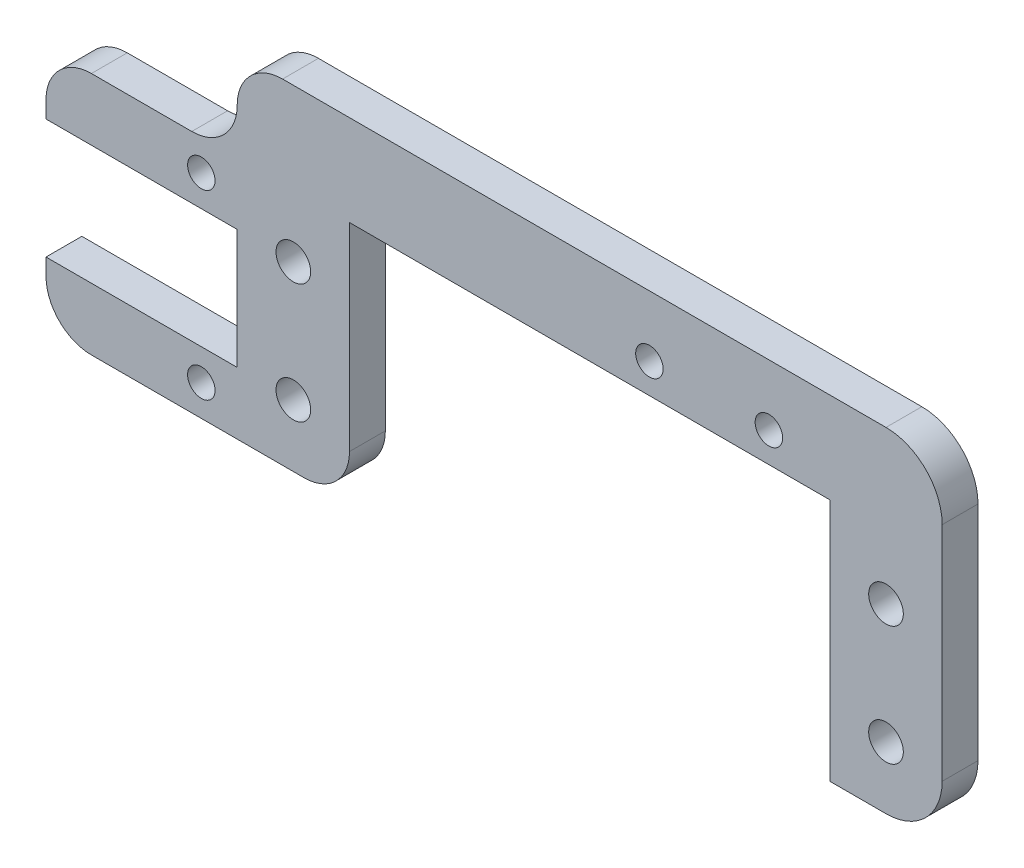
ISO-10303-21;
HEADER;
FILE_DESCRIPTION(('STEP AP214'),'2;1');
FILE_NAME('part.step','',(''),(''),'','','');
FILE_SCHEMA(('AUTOMOTIVE_DESIGN { 1 0 10303 214 1 1 1 1 }'));
ENDSEC;
DATA;
#1=APPLICATION_CONTEXT('core data for automotive mechanical design processes');
#2=APPLICATION_PROTOCOL_DEFINITION('international standard','automotive_design',2000,#1);
#3=PRODUCT_CONTEXT('',#1,'mechanical');
#4=PRODUCT('Part','Part','',(#3));
#5=PRODUCT_RELATED_PRODUCT_CATEGORY('part','',(#4));
#6=PRODUCT_DEFINITION_FORMATION('','',#4);
#7=PRODUCT_DEFINITION_CONTEXT('part definition',#1,'design');
#8=PRODUCT_DEFINITION('design','',#6,#7);
#9=PRODUCT_DEFINITION_SHAPE('','',#8);
#10=(LENGTH_UNIT() NAMED_UNIT(*) SI_UNIT(.MILLI.,.METRE.));
#11=(NAMED_UNIT(*) PLANE_ANGLE_UNIT() SI_UNIT($,.RADIAN.));
#12=(NAMED_UNIT(*) SI_UNIT($,.STERADIAN.) SOLID_ANGLE_UNIT());
#13=UNCERTAINTY_MEASURE_WITH_UNIT(LENGTH_MEASURE(1.E-05),#10,'distance_accuracy_value','');
#14=(GEOMETRIC_REPRESENTATION_CONTEXT(3) GLOBAL_UNCERTAINTY_ASSIGNED_CONTEXT((#13)) GLOBAL_UNIT_ASSIGNED_CONTEXT((#10,
#11,#12)) REPRESENTATION_CONTEXT('',''));
#15=CARTESIAN_POINT('',(0.,0.,0.));
#16=DIRECTION('',(0.,0.,1.));
#17=DIRECTION('',(1.,0.,0.));
#18=AXIS2_PLACEMENT_3D('',#15,#16,#17);
#19=CARTESIAN_POINT('',(8.,-5.,-3.));
#20=DIRECTION('',(-1.,0.,0.));
#21=DIRECTION('',(0.,0.,1.));
#22=AXIS2_PLACEMENT_3D('',#19,#20,#21);
#23=PLANE('',#22);
#24=DIRECTION('',(0.,-1.,0.));
#25=VECTOR('',#24,1.);
#26=CARTESIAN_POINT('',(8.,-5.,0.));
#27=LINE('',#26,#25);
#28=CARTESIAN_POINT('',(8.,5.,0.));
#29=VERTEX_POINT('',#28);
#30=CARTESIAN_POINT('',(8.,-5.,0.));
#31=VERTEX_POINT('',#30);
#32=EDGE_CURVE('E232',#29,#31,#27,.T.);
#33=ORIENTED_EDGE('',*,*,#32,.F.);
#34=DIRECTION('',(0.,0.,1.));
#35=VECTOR('',#34,1.);
#36=CARTESIAN_POINT('',(8.,5.,-3.));
#37=LINE('',#36,#35);
#38=CARTESIAN_POINT('',(8.,5.,-3.));
#39=VERTEX_POINT('',#38);
#40=EDGE_CURVE('E196',#39,#29,#37,.T.);
#41=ORIENTED_EDGE('',*,*,#40,.F.);
#42=DIRECTION('',(0.,-1.,0.));
#43=VECTOR('',#42,1.);
#44=CARTESIAN_POINT('',(8.,-5.,-3.));
#45=LINE('',#44,#43);
#46=CARTESIAN_POINT('',(8.,-5.,-3.));
#47=VERTEX_POINT('',#46);
#48=EDGE_CURVE('E191',#39,#47,#45,.T.);
#49=ORIENTED_EDGE('',*,*,#48,.T.);
#50=DIRECTION('',(0.,0.,1.));
#51=VECTOR('',#50,1.);
#52=CARTESIAN_POINT('',(8.,-5.,-3.));
#53=LINE('',#52,#51);
#54=EDGE_CURVE('E173',#47,#31,#53,.T.);
#55=ORIENTED_EDGE('',*,*,#54,.T.);
#56=EDGE_LOOP('',(#33,#41,#49,#55));
#57=FACE_BOUND('',#56,.T.);
#58=ADVANCED_FACE('F36',(#57),#23,.T.);
#59=CARTESIAN_POINT('',(8.,5.,-3.));
#60=DIRECTION('',(0.,-1.,0.));
#61=DIRECTION('',(1.,0.,0.));
#62=AXIS2_PLACEMENT_3D('',#59,#60,#61);
#63=PLANE('',#62);
#64=DIRECTION('',(1.,0.,0.));
#65=VECTOR('',#64,1.);
#66=CARTESIAN_POINT('',(8.,5.,0.));
#67=LINE('',#66,#65);
#68=CARTESIAN_POINT('',(-8.,5.,0.));
#69=VERTEX_POINT('',#68);
#70=EDGE_CURVE('E197',#69,#29,#67,.T.);
#71=ORIENTED_EDGE('',*,*,#70,.F.);
#72=DIRECTION('',(0.,0.,1.));
#73=VECTOR('',#72,1.);
#74=CARTESIAN_POINT('',(-8.,5.,-3.));
#75=LINE('',#74,#73);
#76=CARTESIAN_POINT('',(-8.,5.,-3.));
#77=VERTEX_POINT('',#76);
#78=EDGE_CURVE('E265',#77,#69,#75,.T.);
#79=ORIENTED_EDGE('',*,*,#78,.F.);
#80=DIRECTION('',(1.,0.,0.));
#81=VECTOR('',#80,1.);
#82=CARTESIAN_POINT('',(8.,5.,-3.));
#83=LINE('',#82,#81);
#84=EDGE_CURVE('E184',#77,#39,#83,.T.);
#85=ORIENTED_EDGE('',*,*,#84,.T.);
#86=ORIENTED_EDGE('',*,*,#40,.T.);
#87=EDGE_LOOP('',(#71,#79,#85,#86));
#88=FACE_BOUND('',#87,.T.);
#89=ADVANCED_FACE('F397',(#88),#63,.T.);
#90=CARTESIAN_POINT('',(-8.,5.,-3.));
#91=DIRECTION('',(-1.,0.,0.));
#92=DIRECTION('',(0.,0.,1.));
#93=AXIS2_PLACEMENT_3D('',#90,#91,#92);
#94=PLANE('',#93);
#95=DIRECTION('',(0.,-1.,0.));
#96=VECTOR('',#95,1.);
#97=CARTESIAN_POINT('',(-8.,5.,0.));
#98=LINE('',#97,#96);
#99=CARTESIAN_POINT('',(-8.,6.4,0.));
#100=VERTEX_POINT('',#99);
#101=EDGE_CURVE('E200',#100,#69,#98,.T.);
#102=ORIENTED_EDGE('',*,*,#101,.F.);
#103=DIRECTION('',(0.,0.,1.));
#104=VECTOR('',#103,1.);
#105=CARTESIAN_POINT('',(-8.,6.4,-3.));
#106=LINE('',#105,#104);
#107=CARTESIAN_POINT('',(-8.,6.4,-3.));
#108=VERTEX_POINT('',#107);
#109=EDGE_CURVE('E326',#100,#108,#106,.F.);
#110=ORIENTED_EDGE('',*,*,#109,.T.);
#111=DIRECTION('',(0.,-1.,0.));
#112=VECTOR('',#111,1.);
#113=CARTESIAN_POINT('',(-8.,5.,-3.));
#114=LINE('',#113,#112);
#115=EDGE_CURVE('E229',#108,#77,#114,.T.);
#116=ORIENTED_EDGE('',*,*,#115,.T.);
#117=ORIENTED_EDGE('',*,*,#78,.T.);
#118=EDGE_LOOP('',(#102,#110,#116,#117));
#119=FACE_BOUND('',#118,.T.);
#120=ADVANCED_FACE('F403',(#119),#94,.T.);
#121=CARTESIAN_POINT('',(-8.,10.2,-3.));
#122=DIRECTION('',(0.,1.,0.));
#123=DIRECTION('',(0.,0.,1.));
#124=AXIS2_PLACEMENT_3D('',#121,#122,#123);
#125=PLANE('',#124);
#126=DIRECTION('',(-1.,0.,0.));
#127=VECTOR('',#126,1.);
#128=CARTESIAN_POINT('',(-8.,10.2,0.));
#129=LINE('',#128,#127);
#130=CARTESIAN_POINT('',(4.2,10.2,0.));
#131=VERTEX_POINT('',#130);
#132=CARTESIAN_POINT('',(-4.2,10.2,0.));
#133=VERTEX_POINT('',#132);
#134=EDGE_CURVE('E259',#131,#133,#129,.T.);
#135=ORIENTED_EDGE('',*,*,#134,.F.);
#136=DIRECTION('',(0.,0.,1.));
#137=VECTOR('',#136,1.);
#138=CARTESIAN_POINT('',(4.2,10.2,-3.));
#139=LINE('',#138,#137);
#140=CARTESIAN_POINT('',(4.2,10.2,-3.));
#141=VERTEX_POINT('',#140);
#142=EDGE_CURVE('E324',#131,#141,#139,.F.);
#143=ORIENTED_EDGE('',*,*,#142,.T.);
#144=DIRECTION('',(-1.,0.,0.));
#145=VECTOR('',#144,1.);
#146=CARTESIAN_POINT('',(-8.,10.2,-3.));
#147=LINE('',#146,#145);
#148=CARTESIAN_POINT('',(-4.2,10.2,-3.));
#149=VERTEX_POINT('',#148);
#150=EDGE_CURVE('E226',#141,#149,#147,.T.);
#151=ORIENTED_EDGE('',*,*,#150,.T.);
#152=DIRECTION('',(0.,0.,1.));
#153=VECTOR('',#152,1.);
#154=CARTESIAN_POINT('',(-4.2,10.2,-3.));
#155=LINE('',#154,#153);
#156=EDGE_CURVE('E321',#149,#133,#155,.T.);
#157=ORIENTED_EDGE('',*,*,#156,.T.);
#158=EDGE_LOOP('',(#135,#143,#151,#157));
#159=FACE_BOUND('',#158,.T.);
#160=ADVANCED_FACE('F336',(#159),#125,.T.);
#161=CARTESIAN_POINT('',(8.,17.8,-3.));
#162=DIRECTION('',(0.,1.,0.));
#163=DIRECTION('',(0.,0.,1.));
#164=AXIS2_PLACEMENT_3D('',#161,#162,#163);
#165=PLANE('',#164);
#166=DIRECTION('',(-1.,0.,0.));
#167=VECTOR('',#166,1.);
#168=CARTESIAN_POINT('',(8.,17.8,-3.));
#169=LINE('',#168,#167);
#170=CARTESIAN_POINT('',(62.3,17.8,-3.));
#171=VERTEX_POINT('',#170);
#172=CARTESIAN_POINT('',(11.8,17.8,-3.));
#173=VERTEX_POINT('',#172);
#174=EDGE_CURVE('E224',#171,#173,#169,.T.);
#175=ORIENTED_EDGE('',*,*,#174,.T.);
#176=DIRECTION('',(0.,0.,1.));
#177=VECTOR('',#176,1.);
#178=CARTESIAN_POINT('',(11.8,17.8,-3.));
#179=LINE('',#178,#177);
#180=CARTESIAN_POINT('',(11.8,17.8,0.));
#181=VERTEX_POINT('',#180);
#182=EDGE_CURVE('E318',#173,#181,#179,.T.);
#183=ORIENTED_EDGE('',*,*,#182,.T.);
#184=DIRECTION('',(-1.,0.,0.));
#185=VECTOR('',#184,1.);
#186=CARTESIAN_POINT('',(8.,17.8,0.));
#187=LINE('',#186,#185);
#188=CARTESIAN_POINT('',(62.3,17.8,0.));
#189=VERTEX_POINT('',#188);
#190=EDGE_CURVE('E256',#189,#181,#187,.T.);
#191=ORIENTED_EDGE('',*,*,#190,.F.);
#192=DIRECTION('',(0.,0.,1.));
#193=VECTOR('',#192,1.);
#194=CARTESIAN_POINT('',(62.3,17.8,-3.));
#195=LINE('',#194,#193);
#196=EDGE_CURVE('E291',#189,#171,#195,.F.);
#197=ORIENTED_EDGE('',*,*,#196,.T.);
#198=EDGE_LOOP('',(#175,#183,#191,#197));
#199=FACE_BOUND('',#198,.T.);
#200=ADVANCED_FACE('F345',(#199),#165,.T.);
#201=CARTESIAN_POINT('',(67.,-10.2,-3.));
#202=DIRECTION('',(1.,0.,0.));
#203=DIRECTION('',(0.,0.,-1.));
#204=AXIS2_PLACEMENT_3D('',#201,#202,#203);
#205=PLANE('',#204);
#206=DIRECTION('',(0.,1.,0.));
#207=VECTOR('',#206,1.);
#208=CARTESIAN_POINT('',(67.,-10.2,0.));
#209=LINE('',#208,#207);
#210=CARTESIAN_POINT('',(67.,-5.49999999999999,0.));
#211=VERTEX_POINT('',#210);
#212=CARTESIAN_POINT('',(67.,13.1,0.));
#213=VERTEX_POINT('',#212);
#214=EDGE_CURVE('E253',#211,#213,#209,.T.);
#215=ORIENTED_EDGE('',*,*,#214,.F.);
#216=DIRECTION('',(0.,0.,1.));
#217=VECTOR('',#216,1.);
#218=CARTESIAN_POINT('',(67.,-5.49999999999999,-3.));
#219=LINE('',#218,#217);
#220=CARTESIAN_POINT('',(67.,-5.49999999999999,-3.));
#221=VERTEX_POINT('',#220);
#222=EDGE_CURVE('E285',#211,#221,#219,.F.);
#223=ORIENTED_EDGE('',*,*,#222,.T.);
#224=DIRECTION('',(0.,1.,0.));
#225=VECTOR('',#224,1.);
#226=CARTESIAN_POINT('',(67.,-10.2,-3.));
#227=LINE('',#226,#225);
#228=CARTESIAN_POINT('',(67.,13.1,-3.));
#229=VERTEX_POINT('',#228);
#230=EDGE_CURVE('E221',#221,#229,#227,.T.);
#231=ORIENTED_EDGE('',*,*,#230,.T.);
#232=DIRECTION('',(0.,0.,1.));
#233=VECTOR('',#232,1.);
#234=CARTESIAN_POINT('',(67.,13.1,-3.));
#235=LINE('',#234,#233);
#236=EDGE_CURVE('E282',#229,#213,#235,.T.);
#237=ORIENTED_EDGE('',*,*,#236,.T.);
#238=EDGE_LOOP('',(#215,#223,#231,#237));
#239=FACE_BOUND('',#238,.T.);
#240=ADVANCED_FACE('F353',(#239),#205,.T.);
#241=CARTESIAN_POINT('',(57.6,-10.2,-3.));
#242=DIRECTION('',(0.,-1.,0.));
#243=DIRECTION('',(0.,0.,-1.));
#244=AXIS2_PLACEMENT_3D('',#241,#242,#243);
#245=PLANE('',#244);
#246=DIRECTION('',(1.,0.,0.));
#247=VECTOR('',#246,1.);
#248=CARTESIAN_POINT('',(57.6,-10.2,-3.));
#249=LINE('',#248,#247);
#250=CARTESIAN_POINT('',(57.6,-10.2,-3.));
#251=VERTEX_POINT('',#250);
#252=CARTESIAN_POINT('',(62.3,-10.2,-3.));
#253=VERTEX_POINT('',#252);
#254=EDGE_CURVE('E218',#251,#253,#249,.T.);
#255=ORIENTED_EDGE('',*,*,#254,.T.);
#256=DIRECTION('',(0.,0.,1.));
#257=VECTOR('',#256,1.);
#258=CARTESIAN_POINT('',(62.3,-10.2,-3.));
#259=LINE('',#258,#257);
#260=CARTESIAN_POINT('',(62.3,-10.2,0.));
#261=VERTEX_POINT('',#260);
#262=EDGE_CURVE('E264',#253,#261,#259,.T.);
#263=ORIENTED_EDGE('',*,*,#262,.T.);
#264=DIRECTION('',(1.,0.,0.));
#265=VECTOR('',#264,1.);
#266=CARTESIAN_POINT('',(57.6,-10.2,0.));
#267=LINE('',#266,#265);
#268=CARTESIAN_POINT('',(57.6,-10.2,0.));
#269=VERTEX_POINT('',#268);
#270=EDGE_CURVE('E250',#269,#261,#267,.T.);
#271=ORIENTED_EDGE('',*,*,#270,.F.);
#272=DIRECTION('',(0.,0.,1.));
#273=VECTOR('',#272,1.);
#274=CARTESIAN_POINT('',(57.6,-10.2,-3.));
#275=LINE('',#274,#273);
#276=EDGE_CURVE('E268',#251,#269,#275,.T.);
#277=ORIENTED_EDGE('',*,*,#276,.F.);
#278=EDGE_LOOP('',(#255,#263,#271,#277));
#279=FACE_BOUND('',#278,.T.);
#280=ADVANCED_FACE('F363',(#279),#245,.T.);
#281=CARTESIAN_POINT('',(57.6,10.2,-3.));
#282=DIRECTION('',(-1.,0.,0.));
#283=DIRECTION('',(0.,0.,1.));
#284=AXIS2_PLACEMENT_3D('',#281,#282,#283);
#285=PLANE('',#284);
#286=DIRECTION('',(0.,-1.,0.));
#287=VECTOR('',#286,1.);
#288=CARTESIAN_POINT('',(57.6,10.2,0.));
#289=LINE('',#288,#287);
#290=CARTESIAN_POINT('',(57.6,10.2,0.));
#291=VERTEX_POINT('',#290);
#292=EDGE_CURVE('E247',#291,#269,#289,.T.);
#293=ORIENTED_EDGE('',*,*,#292,.F.);
#294=DIRECTION('',(0.,0.,1.));
#295=VECTOR('',#294,1.);
#296=CARTESIAN_POINT('',(57.6,10.2,-3.));
#297=LINE('',#296,#295);
#298=CARTESIAN_POINT('',(57.6,10.2,-3.));
#299=VERTEX_POINT('',#298);
#300=EDGE_CURVE('E270',#299,#291,#297,.T.);
#301=ORIENTED_EDGE('',*,*,#300,.F.);
#302=DIRECTION('',(0.,-1.,0.));
#303=VECTOR('',#302,1.);
#304=CARTESIAN_POINT('',(57.6,10.2,-3.));
#305=LINE('',#304,#303);
#306=EDGE_CURVE('E215',#299,#251,#305,.T.);
#307=ORIENTED_EDGE('',*,*,#306,.T.);
#308=ORIENTED_EDGE('',*,*,#276,.T.);
#309=EDGE_LOOP('',(#293,#301,#307,#308));
#310=FACE_BOUND('',#309,.T.);
#311=ADVANCED_FACE('F367',(#310),#285,.T.);
#312=CARTESIAN_POINT('',(17.4,10.2,-3.));
#313=DIRECTION('',(0.,-1.,0.));
#314=DIRECTION('',(0.,0.,-1.));
#315=AXIS2_PLACEMENT_3D('',#312,#313,#314);
#316=PLANE('',#315);
#317=DIRECTION('',(1.,0.,0.));
#318=VECTOR('',#317,1.);
#319=CARTESIAN_POINT('',(17.4,10.2,0.));
#320=LINE('',#319,#318);
#321=CARTESIAN_POINT('',(17.4,10.2,0.));
#322=VERTEX_POINT('',#321);
#323=EDGE_CURVE('E244',#322,#291,#320,.T.);
#324=ORIENTED_EDGE('',*,*,#323,.F.);
#325=DIRECTION('',(0.,0.,1.));
#326=VECTOR('',#325,1.);
#327=CARTESIAN_POINT('',(17.4,10.2,-3.));
#328=LINE('',#327,#326);
#329=CARTESIAN_POINT('',(17.4,10.2,-3.));
#330=VERTEX_POINT('',#329);
#331=EDGE_CURVE('E272',#330,#322,#328,.T.);
#332=ORIENTED_EDGE('',*,*,#331,.F.);
#333=DIRECTION('',(1.,0.,0.));
#334=VECTOR('',#333,1.);
#335=CARTESIAN_POINT('',(17.4,10.2,-3.));
#336=LINE('',#335,#334);
#337=EDGE_CURVE('E212',#330,#299,#336,.T.);
#338=ORIENTED_EDGE('',*,*,#337,.T.);
#339=ORIENTED_EDGE('',*,*,#300,.T.);
#340=EDGE_LOOP('',(#324,#332,#338,#339));
#341=FACE_BOUND('',#340,.T.);
#342=ADVANCED_FACE('F372',(#341),#316,.T.);
#343=CARTESIAN_POINT('',(17.4,-10.2,-3.));
#344=DIRECTION('',(1.,0.,0.));
#345=DIRECTION('',(0.,0.,-1.));
#346=AXIS2_PLACEMENT_3D('',#343,#344,#345);
#347=PLANE('',#346);
#348=DIRECTION('',(0.,1.,0.));
#349=VECTOR('',#348,1.);
#350=CARTESIAN_POINT('',(17.4,-10.2,0.));
#351=LINE('',#350,#349);
#352=CARTESIAN_POINT('',(17.4,-6.4,0.));
#353=VERTEX_POINT('',#352);
#354=EDGE_CURVE('E242',#353,#322,#351,.T.);
#355=ORIENTED_EDGE('',*,*,#354,.F.);
#356=DIRECTION('',(0.,0.,1.));
#357=VECTOR('',#356,1.);
#358=CARTESIAN_POINT('',(17.4,-6.4,-3.));
#359=LINE('',#358,#357);
#360=CARTESIAN_POINT('',(17.4,-6.4,-3.));
#361=VERTEX_POINT('',#360);
#362=EDGE_CURVE('E306',#353,#361,#359,.F.);
#363=ORIENTED_EDGE('',*,*,#362,.T.);
#364=DIRECTION('',(0.,1.,0.));
#365=VECTOR('',#364,1.);
#366=CARTESIAN_POINT('',(17.4,-10.2,-3.));
#367=LINE('',#366,#365);
#368=EDGE_CURVE('E210',#361,#330,#367,.T.);
#369=ORIENTED_EDGE('',*,*,#368,.T.);
#370=ORIENTED_EDGE('',*,*,#331,.T.);
#371=EDGE_LOOP('',(#355,#363,#369,#370));
#372=FACE_BOUND('',#371,.T.);
#373=ADVANCED_FACE('F375',(#372),#347,.T.);
#374=CARTESIAN_POINT('',(-8.,-10.2,-3.));
#375=DIRECTION('',(0.,-1.,0.));
#376=DIRECTION('',(0.,0.,-1.));
#377=AXIS2_PLACEMENT_3D('',#374,#375,#376);
#378=PLANE('',#377);
#379=DIRECTION('',(1.,0.,0.));
#380=VECTOR('',#379,1.);
#381=CARTESIAN_POINT('',(-8.,-10.2,-3.));
#382=LINE('',#381,#380);
#383=CARTESIAN_POINT('',(-4.2,-10.2,-3.));
#384=VERTEX_POINT('',#383);
#385=CARTESIAN_POINT('',(13.6,-10.2,-3.));
#386=VERTEX_POINT('',#385);
#387=EDGE_CURVE('E207',#384,#386,#382,.T.);
#388=ORIENTED_EDGE('',*,*,#387,.T.);
#389=DIRECTION('',(0.,0.,1.));
#390=VECTOR('',#389,1.);
#391=CARTESIAN_POINT('',(13.6,-10.2,-3.));
#392=LINE('',#391,#390);
#393=CARTESIAN_POINT('',(13.6,-10.2,0.));
#394=VERTEX_POINT('',#393);
#395=EDGE_CURVE('E295',#386,#394,#392,.T.);
#396=ORIENTED_EDGE('',*,*,#395,.T.);
#397=DIRECTION('',(1.,0.,0.));
#398=VECTOR('',#397,1.);
#399=CARTESIAN_POINT('',(-8.,-10.2,0.));
#400=LINE('',#399,#398);
#401=CARTESIAN_POINT('',(-4.2,-10.2,0.));
#402=VERTEX_POINT('',#401);
#403=EDGE_CURVE('E239',#402,#394,#400,.T.);
#404=ORIENTED_EDGE('',*,*,#403,.F.);
#405=DIRECTION('',(0.,0.,1.));
#406=VECTOR('',#405,1.);
#407=CARTESIAN_POINT('',(-4.2,-10.2,-3.));
#408=LINE('',#407,#406);
#409=EDGE_CURVE('E293',#402,#384,#408,.F.);
#410=ORIENTED_EDGE('',*,*,#409,.T.);
#411=EDGE_LOOP('',(#388,#396,#404,#410));
#412=FACE_BOUND('',#411,.T.);
#413=ADVANCED_FACE('F384',(#412),#378,.T.);
#414=CARTESIAN_POINT('',(-8.,-10.2,-3.));
#415=DIRECTION('',(-1.,0.,0.));
#416=DIRECTION('',(0.,-1.,0.));
#417=AXIS2_PLACEMENT_3D('',#414,#415,#416);
#418=PLANE('',#417);
#419=DIRECTION('',(0.,-1.,0.));
#420=VECTOR('',#419,1.);
#421=CARTESIAN_POINT('',(-8.,-10.2,-3.));
#422=LINE('',#421,#420);
#423=CARTESIAN_POINT('',(-8.,-5.,-3.));
#424=VERTEX_POINT('',#423);
#425=CARTESIAN_POINT('',(-8.,-6.4,-3.));
#426=VERTEX_POINT('',#425);
#427=EDGE_CURVE('E194',#424,#426,#422,.T.);
#428=ORIENTED_EDGE('',*,*,#427,.T.);
#429=DIRECTION('',(0.,0.,1.));
#430=VECTOR('',#429,1.);
#431=CARTESIAN_POINT('',(-8.,-6.4,-3.));
#432=LINE('',#431,#430);
#433=CARTESIAN_POINT('',(-8.,-6.4,0.));
#434=VERTEX_POINT('',#433);
#435=EDGE_CURVE('E315',#426,#434,#432,.T.);
#436=ORIENTED_EDGE('',*,*,#435,.T.);
#437=DIRECTION('',(0.,-1.,0.));
#438=VECTOR('',#437,1.);
#439=CARTESIAN_POINT('',(-8.,-10.2,0.));
#440=LINE('',#439,#438);
#441=CARTESIAN_POINT('',(-8.,-5.,0.));
#442=VERTEX_POINT('',#441);
#443=EDGE_CURVE('E236',#442,#434,#440,.T.);
#444=ORIENTED_EDGE('',*,*,#443,.F.);
#445=DIRECTION('',(0.,0.,1.));
#446=VECTOR('',#445,1.);
#447=CARTESIAN_POINT('',(-8.,-5.,-3.));
#448=LINE('',#447,#446);
#449=EDGE_CURVE('E183',#424,#442,#448,.T.);
#450=ORIENTED_EDGE('',*,*,#449,.F.);
#451=EDGE_LOOP('',(#428,#436,#444,#450));
#452=FACE_BOUND('',#451,.T.);
#453=ADVANCED_FACE('F392',(#452),#418,.T.);
#454=CARTESIAN_POINT('',(-8.,-5.,-3.));
#455=DIRECTION('',(0.,1.,0.));
#456=DIRECTION('',(-1.,0.,0.));
#457=AXIS2_PLACEMENT_3D('',#454,#455,#456);
#458=PLANE('',#457);
#459=DIRECTION('',(-1.,0.,0.));
#460=VECTOR('',#459,1.);
#461=CARTESIAN_POINT('',(-8.,-5.,0.));
#462=LINE('',#461,#460);
#463=EDGE_CURVE('E178',#31,#442,#462,.T.);
#464=ORIENTED_EDGE('',*,*,#463,.F.);
#465=ORIENTED_EDGE('',*,*,#54,.F.);
#466=DIRECTION('',(-1.,0.,0.));
#467=VECTOR('',#466,1.);
#468=CARTESIAN_POINT('',(-8.,-5.,-3.));
#469=LINE('',#468,#467);
#470=EDGE_CURVE('E176',#47,#424,#469,.T.);
#471=ORIENTED_EDGE('',*,*,#470,.T.);
#472=ORIENTED_EDGE('',*,*,#449,.T.);
#473=EDGE_LOOP('',(#464,#465,#471,#472));
#474=FACE_BOUND('',#473,.T.);
#475=ADVANCED_FACE('F175',(#474),#458,.T.);
#476=CARTESIAN_POINT('',(0.,0.,-3.));
#477=DIRECTION('',(0.,0.,1.));
#478=DIRECTION('',(1.,0.,0.));
#479=AXIS2_PLACEMENT_3D('',#476,#477,#478);
#480=PLANE('',#479);
#481=CARTESIAN_POINT('',(5.00000000000003,7.6,-3.));
#482=DIRECTION('',(0.,0.,1.));
#483=DIRECTION('',(1.,0.,0.));
#484=AXIS2_PLACEMENT_3D('',#481,#482,#483);
#485=CIRCLE('',#484,1.14999999999997);
#486=CARTESIAN_POINT('',(6.15,7.6,-3.));
#487=VERTEX_POINT('',#486);
#488=EDGE_CURVE('E663',#487,#487,#485,.T.);
#489=ORIENTED_EDGE('',*,*,#488,.T.);
#490=EDGE_LOOP('',(#489));
#491=FACE_BOUND('',#490,.T.);
#492=CARTESIAN_POINT('',(5.00000000000016,-7.6,-3.));
#493=DIRECTION('',(0.,0.,1.));
#494=DIRECTION('',(1.,0.,0.));
#495=AXIS2_PLACEMENT_3D('',#492,#493,#494);
#496=CIRCLE('',#495,1.15);
#497=CARTESIAN_POINT('',(6.15000000000016,-7.6,-3.));
#498=VERTEX_POINT('',#497);
#499=EDGE_CURVE('E667',#498,#498,#496,.T.);
#500=ORIENTED_EDGE('',*,*,#499,.T.);
#501=EDGE_LOOP('',(#500));
#502=FACE_BOUND('',#501,.T.);
#503=CARTESIAN_POINT('',(62.3,5.00000000000004,-3.));
#504=DIRECTION('',(0.,0.,-1.));
#505=DIRECTION('',(-1.,0.,0.));
#506=AXIS2_PLACEMENT_3D('',#503,#504,#505);
#507=CIRCLE('',#506,1.45);
#508=CARTESIAN_POINT('',(60.8500000000001,5.00000000000004,-3.));
#509=VERTEX_POINT('',#508);
#510=EDGE_CURVE('E671',#509,#509,#507,.T.);
#511=ORIENTED_EDGE('',*,*,#510,.F.);
#512=EDGE_LOOP('',(#511));
#513=FACE_BOUND('',#512,.T.);
#514=CARTESIAN_POINT('',(12.7000000000001,5.00000000000004,-3.));
#515=DIRECTION('',(0.,0.,-1.));
#516=DIRECTION('',(-1.,0.,0.));
#517=AXIS2_PLACEMENT_3D('',#514,#515,#516);
#518=CIRCLE('',#517,1.45);
#519=CARTESIAN_POINT('',(11.2500000000001,5.00000000000004,-3.));
#520=VERTEX_POINT('',#519);
#521=EDGE_CURVE('E675',#520,#520,#518,.T.);
#522=ORIENTED_EDGE('',*,*,#521,.F.);
#523=EDGE_LOOP('',(#522));
#524=FACE_BOUND('',#523,.T.);
#525=CARTESIAN_POINT('',(12.7,-4.99999999999996,-3.));
#526=DIRECTION('',(0.,0.,-1.));
#527=DIRECTION('',(-1.,0.,0.));
#528=AXIS2_PLACEMENT_3D('',#525,#526,#527);
#529=CIRCLE('',#528,1.45);
#530=CARTESIAN_POINT('',(11.25,-4.99999999999996,-3.));
#531=VERTEX_POINT('',#530);
#532=EDGE_CURVE('E679',#531,#531,#529,.T.);
#533=ORIENTED_EDGE('',*,*,#532,.F.);
#534=EDGE_LOOP('',(#533));
#535=FACE_BOUND('',#534,.T.);
#536=CARTESIAN_POINT('',(62.3,-4.99999999999996,-3.));
#537=DIRECTION('',(0.,0.,-1.));
#538=DIRECTION('',(-1.,0.,0.));
#539=AXIS2_PLACEMENT_3D('',#536,#537,#538);
#540=CIRCLE('',#539,1.45);
#541=CARTESIAN_POINT('',(60.85,-4.99999999999996,-3.));
#542=VERTEX_POINT('',#541);
#543=EDGE_CURVE('E683',#542,#542,#540,.T.);
#544=ORIENTED_EDGE('',*,*,#543,.F.);
#545=EDGE_LOOP('',(#544));
#546=FACE_BOUND('',#545,.T.);
#547=CARTESIAN_POINT('',(52.5,12.7,-3.));
#548=DIRECTION('',(0.,0.,-1.));
#549=DIRECTION('',(-1.,0.,0.));
#550=AXIS2_PLACEMENT_3D('',#547,#548,#549);
#551=CIRCLE('',#550,1.15);
#552=CARTESIAN_POINT('',(51.35,12.7,-3.));
#553=VERTEX_POINT('',#552);
#554=EDGE_CURVE('E234',#553,#553,#551,.T.);
#555=ORIENTED_EDGE('',*,*,#554,.F.);
#556=EDGE_LOOP('',(#555));
#557=FACE_BOUND('',#556,.T.);
#558=CARTESIAN_POINT('',(42.5,12.7,-3.));
#559=DIRECTION('',(0.,0.,-1.));
#560=DIRECTION('',(-1.,0.,0.));
#561=AXIS2_PLACEMENT_3D('',#558,#559,#560);
#562=CIRCLE('',#561,1.15);
#563=CARTESIAN_POINT('',(41.35,12.7,-3.));
#564=VERTEX_POINT('',#563);
#565=EDGE_CURVE('E689',#564,#564,#562,.T.);
#566=ORIENTED_EDGE('',*,*,#565,.F.);
#567=EDGE_LOOP('',(#566));
#568=FACE_BOUND('',#567,.T.);
#569=ORIENTED_EDGE('',*,*,#368,.F.);
#570=CARTESIAN_POINT('',(13.6,-6.4,-3.));
#571=DIRECTION('',(0.,0.,1.));
#572=DIRECTION('',(1.,0.,0.));
#573=AXIS2_PLACEMENT_3D('',#570,#571,#572);
#574=CIRCLE('',#573,3.8);
#575=EDGE_CURVE('E313',#361,#386,#574,.F.);
#576=ORIENTED_EDGE('',*,*,#575,.T.);
#577=ORIENTED_EDGE('',*,*,#387,.F.);
#578=CARTESIAN_POINT('',(-4.2,-6.4,-3.));
#579=DIRECTION('',(0.,0.,1.));
#580=DIRECTION('',(1.,0.,0.));
#581=AXIS2_PLACEMENT_3D('',#578,#579,#580);
#582=CIRCLE('',#581,3.8);
#583=EDGE_CURVE('E311',#384,#426,#582,.F.);
#584=ORIENTED_EDGE('',*,*,#583,.T.);
#585=ORIENTED_EDGE('',*,*,#427,.F.);
#586=ORIENTED_EDGE('',*,*,#470,.F.);
#587=ORIENTED_EDGE('',*,*,#48,.F.);
#588=ORIENTED_EDGE('',*,*,#84,.F.);
#589=ORIENTED_EDGE('',*,*,#115,.F.);
#590=CARTESIAN_POINT('',(-4.2,6.4,-3.));
#591=DIRECTION('',(0.,0.,1.));
#592=DIRECTION('',(1.,0.,0.));
#593=AXIS2_PLACEMENT_3D('',#590,#591,#592);
#594=CIRCLE('',#593,3.8);
#595=EDGE_CURVE('E308',#108,#149,#594,.F.);
#596=ORIENTED_EDGE('',*,*,#595,.T.);
#597=ORIENTED_EDGE('',*,*,#150,.F.);
#598=CARTESIAN_POINT('',(4.2,14.,-3.));
#599=DIRECTION('',(0.,0.,1.));
#600=DIRECTION('',(1.,0.,0.));
#601=AXIS2_PLACEMENT_3D('',#598,#599,#600);
#602=CIRCLE('',#601,3.8);
#603=CARTESIAN_POINT('',(8.,14.,-3.));
#604=VERTEX_POINT('',#603);
#605=EDGE_CURVE('E11',#141,#604,#602,.T.);
#606=ORIENTED_EDGE('',*,*,#605,.T.);
#607=CARTESIAN_POINT('',(11.8,14.,-3.));
#608=DIRECTION('',(0.,0.,1.));
#609=DIRECTION('',(1.,0.,0.));
#610=AXIS2_PLACEMENT_3D('',#607,#608,#609);
#611=CIRCLE('',#610,3.8);
#612=EDGE_CURVE('E51',#604,#173,#611,.F.);
#613=ORIENTED_EDGE('',*,*,#612,.T.);
#614=ORIENTED_EDGE('',*,*,#174,.F.);
#615=CARTESIAN_POINT('',(62.3,13.1,-3.));
#616=DIRECTION('',(0.,0.,1.));
#617=DIRECTION('',(1.,0.,0.));
#618=AXIS2_PLACEMENT_3D('',#615,#616,#617);
#619=CIRCLE('',#618,4.7);
#620=EDGE_CURVE('E287',#171,#229,#619,.F.);
#621=ORIENTED_EDGE('',*,*,#620,.T.);
#622=ORIENTED_EDGE('',*,*,#230,.F.);
#623=CARTESIAN_POINT('',(62.3,-5.49999999999999,-3.));
#624=DIRECTION('',(0.,0.,1.));
#625=DIRECTION('',(1.,0.,0.));
#626=AXIS2_PLACEMENT_3D('',#623,#624,#625);
#627=CIRCLE('',#626,4.7);
#628=EDGE_CURVE('E289',#221,#253,#627,.F.);
#629=ORIENTED_EDGE('',*,*,#628,.T.);
#630=ORIENTED_EDGE('',*,*,#254,.F.);
#631=ORIENTED_EDGE('',*,*,#306,.F.);
#632=ORIENTED_EDGE('',*,*,#337,.F.);
#633=EDGE_LOOP('',(#569,#576,#577,#584,#585,#586,#587,#588,#589,#596,#597,#606,#613,#614,#621,
#622,#629,#630,#631,#632));
#634=FACE_BOUND('',#633,.T.);
#635=ADVANCED_FACE('F189',(#491,#502,#513,#524,#535,#546,#557,#568,#634),#480,.F.);
#636=CARTESIAN_POINT('',(0.,0.,0.));
#637=DIRECTION('',(0.,0.,1.));
#638=DIRECTION('',(1.,0.,0.));
#639=AXIS2_PLACEMENT_3D('',#636,#637,#638);
#640=PLANE('',#639);
#641=CARTESIAN_POINT('',(5.00000000000003,7.6,0.));
#642=DIRECTION('',(0.,0.,1.));
#643=DIRECTION('',(1.,0.,0.));
#644=AXIS2_PLACEMENT_3D('',#641,#642,#643);
#645=CIRCLE('',#644,1.14999999999997);
#646=CARTESIAN_POINT('',(6.15,7.6,0.));
#647=VERTEX_POINT('',#646);
#648=EDGE_CURVE('E715',#647,#647,#645,.T.);
#649=ORIENTED_EDGE('',*,*,#648,.F.);
#650=EDGE_LOOP('',(#649));
#651=FACE_BOUND('',#650,.T.);
#652=CARTESIAN_POINT('',(5.00000000000016,-7.6,0.));
#653=DIRECTION('',(0.,0.,1.));
#654=DIRECTION('',(1.,0.,0.));
#655=AXIS2_PLACEMENT_3D('',#652,#653,#654);
#656=CIRCLE('',#655,1.15);
#657=CARTESIAN_POINT('',(6.15000000000016,-7.6,0.));
#658=VERTEX_POINT('',#657);
#659=EDGE_CURVE('E340',#658,#658,#656,.T.);
#660=ORIENTED_EDGE('',*,*,#659,.F.);
#661=EDGE_LOOP('',(#660));
#662=FACE_BOUND('',#661,.T.);
#663=CARTESIAN_POINT('',(62.3,5.00000000000004,0.));
#664=DIRECTION('',(0.,0.,-1.));
#665=DIRECTION('',(-1.,0.,0.));
#666=AXIS2_PLACEMENT_3D('',#663,#664,#665);
#667=CIRCLE('',#666,1.45);
#668=CARTESIAN_POINT('',(60.8500000000001,5.00000000000004,0.));
#669=VERTEX_POINT('',#668);
#670=EDGE_CURVE('E700',#669,#669,#667,.T.);
#671=ORIENTED_EDGE('',*,*,#670,.T.);
#672=EDGE_LOOP('',(#671));
#673=FACE_BOUND('',#672,.T.);
#674=CARTESIAN_POINT('',(12.7000000000001,5.00000000000004,0.));
#675=DIRECTION('',(0.,0.,-1.));
#676=DIRECTION('',(-1.,0.,0.));
#677=AXIS2_PLACEMENT_3D('',#674,#675,#676);
#678=CIRCLE('',#677,1.45);
#679=CARTESIAN_POINT('',(11.2500000000001,5.00000000000004,0.));
#680=VERTEX_POINT('',#679);
#681=EDGE_CURVE('E704',#680,#680,#678,.T.);
#682=ORIENTED_EDGE('',*,*,#681,.T.);
#683=EDGE_LOOP('',(#682));
#684=FACE_BOUND('',#683,.T.);
#685=CARTESIAN_POINT('',(12.7,-4.99999999999996,0.));
#686=DIRECTION('',(0.,0.,-1.));
#687=DIRECTION('',(-1.,0.,0.));
#688=AXIS2_PLACEMENT_3D('',#685,#686,#687);
#689=CIRCLE('',#688,1.45);
#690=CARTESIAN_POINT('',(11.25,-4.99999999999996,0.));
#691=VERTEX_POINT('',#690);
#692=EDGE_CURVE('E708',#691,#691,#689,.T.);
#693=ORIENTED_EDGE('',*,*,#692,.T.);
#694=EDGE_LOOP('',(#693));
#695=FACE_BOUND('',#694,.T.);
#696=CARTESIAN_POINT('',(62.3,-4.99999999999996,0.));
#697=DIRECTION('',(0.,0.,-1.));
#698=DIRECTION('',(-1.,0.,0.));
#699=AXIS2_PLACEMENT_3D('',#696,#697,#698);
#700=CIRCLE('',#699,1.45);
#701=CARTESIAN_POINT('',(60.85,-4.99999999999996,0.));
#702=VERTEX_POINT('',#701);
#703=EDGE_CURVE('E696',#702,#702,#700,.T.);
#704=ORIENTED_EDGE('',*,*,#703,.T.);
#705=EDGE_LOOP('',(#704));
#706=FACE_BOUND('',#705,.T.);
#707=CARTESIAN_POINT('',(52.5,12.7,0.));
#708=DIRECTION('',(0.,0.,-1.));
#709=DIRECTION('',(-1.,0.,0.));
#710=AXIS2_PLACEMENT_3D('',#707,#708,#709);
#711=CIRCLE('',#710,1.15);
#712=CARTESIAN_POINT('',(51.35,12.7,0.));
#713=VERTEX_POINT('',#712);
#714=EDGE_CURVE('E690',#713,#713,#711,.T.);
#715=ORIENTED_EDGE('',*,*,#714,.T.);
#716=EDGE_LOOP('',(#715));
#717=FACE_BOUND('',#716,.T.);
#718=CARTESIAN_POINT('',(42.5,12.7,0.));
#719=DIRECTION('',(0.,0.,-1.));
#720=DIRECTION('',(-1.,0.,0.));
#721=AXIS2_PLACEMENT_3D('',#718,#719,#720);
#722=CIRCLE('',#721,1.15);
#723=CARTESIAN_POINT('',(41.35,12.7,0.));
#724=VERTEX_POINT('',#723);
#725=EDGE_CURVE('E203',#724,#724,#722,.T.);
#726=ORIENTED_EDGE('',*,*,#725,.T.);
#727=EDGE_LOOP('',(#726));
#728=FACE_BOUND('',#727,.T.);
#729=ORIENTED_EDGE('',*,*,#403,.T.);
#730=CARTESIAN_POINT('',(13.6,-6.4,0.));
#731=DIRECTION('',(0.,0.,1.));
#732=DIRECTION('',(1.,0.,0.));
#733=AXIS2_PLACEMENT_3D('',#730,#731,#732);
#734=CIRCLE('',#733,3.8);
#735=EDGE_CURVE('E304',#394,#353,#734,.T.);
#736=ORIENTED_EDGE('',*,*,#735,.T.);
#737=ORIENTED_EDGE('',*,*,#354,.T.);
#738=ORIENTED_EDGE('',*,*,#323,.T.);
#739=ORIENTED_EDGE('',*,*,#292,.T.);
#740=ORIENTED_EDGE('',*,*,#270,.T.);
#741=CARTESIAN_POINT('',(62.3,-5.49999999999999,0.));
#742=DIRECTION('',(0.,0.,1.));
#743=DIRECTION('',(1.,0.,0.));
#744=AXIS2_PLACEMENT_3D('',#741,#742,#743);
#745=CIRCLE('',#744,4.7);
#746=EDGE_CURVE('E280',#261,#211,#745,.T.);
#747=ORIENTED_EDGE('',*,*,#746,.T.);
#748=ORIENTED_EDGE('',*,*,#214,.T.);
#749=CARTESIAN_POINT('',(62.3,13.1,0.));
#750=DIRECTION('',(0.,0.,1.));
#751=DIRECTION('',(1.,0.,0.));
#752=AXIS2_PLACEMENT_3D('',#749,#750,#751);
#753=CIRCLE('',#752,4.7);
#754=EDGE_CURVE('E278',#213,#189,#753,.T.);
#755=ORIENTED_EDGE('',*,*,#754,.T.);
#756=ORIENTED_EDGE('',*,*,#190,.T.);
#757=CARTESIAN_POINT('',(11.8,14.,0.));
#758=DIRECTION('',(0.,0.,1.));
#759=DIRECTION('',(1.,0.,0.));
#760=AXIS2_PLACEMENT_3D('',#757,#758,#759);
#761=CIRCLE('',#760,3.8);
#762=CARTESIAN_POINT('',(8.,14.,0.));
#763=VERTEX_POINT('',#762);
#764=EDGE_CURVE('E300',#181,#763,#761,.T.);
#765=ORIENTED_EDGE('',*,*,#764,.T.);
#766=CARTESIAN_POINT('',(4.2,14.,0.));
#767=DIRECTION('',(0.,0.,1.));
#768=DIRECTION('',(1.,0.,0.));
#769=AXIS2_PLACEMENT_3D('',#766,#767,#768);
#770=CIRCLE('',#769,3.8);
#771=EDGE_CURVE('E45',#763,#131,#770,.F.);
#772=ORIENTED_EDGE('',*,*,#771,.T.);
#773=ORIENTED_EDGE('',*,*,#134,.T.);
#774=CARTESIAN_POINT('',(-4.2,6.4,0.));
#775=DIRECTION('',(0.,0.,1.));
#776=DIRECTION('',(1.,0.,0.));
#777=AXIS2_PLACEMENT_3D('',#774,#775,#776);
#778=CIRCLE('',#777,3.8);
#779=EDGE_CURVE('E298',#133,#100,#778,.T.);
#780=ORIENTED_EDGE('',*,*,#779,.T.);
#781=ORIENTED_EDGE('',*,*,#101,.T.);
#782=ORIENTED_EDGE('',*,*,#70,.T.);
#783=ORIENTED_EDGE('',*,*,#32,.T.);
#784=ORIENTED_EDGE('',*,*,#463,.T.);
#785=ORIENTED_EDGE('',*,*,#443,.T.);
#786=CARTESIAN_POINT('',(-4.2,-6.4,0.));
#787=DIRECTION('',(0.,0.,1.));
#788=DIRECTION('',(1.,0.,0.));
#789=AXIS2_PLACEMENT_3D('',#786,#787,#788);
#790=CIRCLE('',#789,3.8);
#791=EDGE_CURVE('E302',#434,#402,#790,.T.);
#792=ORIENTED_EDGE('',*,*,#791,.T.);
#793=EDGE_LOOP('',(#729,#736,#737,#738,#739,#740,#747,#748,#755,#756,#765,#772,#773,#780,#781,
#782,#783,#784,#785,#792));
#794=FACE_BOUND('',#793,.T.);
#795=ADVANCED_FACE('F331',(#651,#662,#673,#684,#695,#706,#717,#728,#794),#640,.T.);
#796=CARTESIAN_POINT('',(42.5,12.7,-3.));
#797=DIRECTION('',(0.,0.,1.));
#798=DIRECTION('',(1.,0.,0.));
#799=AXIS2_PLACEMENT_3D('',#796,#797,#798);
#800=CYLINDRICAL_SURFACE('',#799,1.15);
#801=ORIENTED_EDGE('',*,*,#565,.T.);
#802=EDGE_LOOP('',(#801));
#803=FACE_BOUND('',#802,.T.);
#804=ORIENTED_EDGE('',*,*,#725,.F.);
#805=EDGE_LOOP('',(#804));
#806=FACE_BOUND('',#805,.T.);
#807=ADVANCED_FACE('F533',(#803,#806),#800,.F.);
#808=CARTESIAN_POINT('',(52.5,12.7,-3.));
#809=DIRECTION('',(0.,0.,1.));
#810=DIRECTION('',(1.,0.,0.));
#811=AXIS2_PLACEMENT_3D('',#808,#809,#810);
#812=CYLINDRICAL_SURFACE('',#811,1.15);
#813=ORIENTED_EDGE('',*,*,#554,.T.);
#814=EDGE_LOOP('',(#813));
#815=FACE_BOUND('',#814,.T.);
#816=ORIENTED_EDGE('',*,*,#714,.F.);
#817=EDGE_LOOP('',(#816));
#818=FACE_BOUND('',#817,.T.);
#819=ADVANCED_FACE('F524',(#815,#818),#812,.F.);
#820=CARTESIAN_POINT('',(62.3,-4.99999999999996,-3.));
#821=DIRECTION('',(0.,0.,1.));
#822=DIRECTION('',(1.,0.,0.));
#823=AXIS2_PLACEMENT_3D('',#820,#821,#822);
#824=CYLINDRICAL_SURFACE('',#823,1.45);
#825=ORIENTED_EDGE('',*,*,#543,.T.);
#826=EDGE_LOOP('',(#825));
#827=FACE_BOUND('',#826,.T.);
#828=ORIENTED_EDGE('',*,*,#703,.F.);
#829=EDGE_LOOP('',(#828));
#830=FACE_BOUND('',#829,.T.);
#831=ADVANCED_FACE('F515',(#827,#830),#824,.F.);
#832=CARTESIAN_POINT('',(12.7,-4.99999999999996,-3.));
#833=DIRECTION('',(0.,0.,1.));
#834=DIRECTION('',(1.,0.,0.));
#835=AXIS2_PLACEMENT_3D('',#832,#833,#834);
#836=CYLINDRICAL_SURFACE('',#835,1.45);
#837=ORIENTED_EDGE('',*,*,#532,.T.);
#838=EDGE_LOOP('',(#837));
#839=FACE_BOUND('',#838,.T.);
#840=ORIENTED_EDGE('',*,*,#692,.F.);
#841=EDGE_LOOP('',(#840));
#842=FACE_BOUND('',#841,.T.);
#843=ADVANCED_FACE('F506',(#839,#842),#836,.F.);
#844=CARTESIAN_POINT('',(12.7000000000001,5.00000000000004,-3.));
#845=DIRECTION('',(0.,0.,1.));
#846=DIRECTION('',(1.,0.,0.));
#847=AXIS2_PLACEMENT_3D('',#844,#845,#846);
#848=CYLINDRICAL_SURFACE('',#847,1.45);
#849=ORIENTED_EDGE('',*,*,#521,.T.);
#850=EDGE_LOOP('',(#849));
#851=FACE_BOUND('',#850,.T.);
#852=ORIENTED_EDGE('',*,*,#681,.F.);
#853=EDGE_LOOP('',(#852));
#854=FACE_BOUND('',#853,.T.);
#855=ADVANCED_FACE('F497',(#851,#854),#848,.F.);
#856=CARTESIAN_POINT('',(62.3,5.00000000000004,-3.));
#857=DIRECTION('',(0.,0.,1.));
#858=DIRECTION('',(1.,0.,0.));
#859=AXIS2_PLACEMENT_3D('',#856,#857,#858);
#860=CYLINDRICAL_SURFACE('',#859,1.45);
#861=ORIENTED_EDGE('',*,*,#510,.T.);
#862=EDGE_LOOP('',(#861));
#863=FACE_BOUND('',#862,.T.);
#864=ORIENTED_EDGE('',*,*,#670,.F.);
#865=EDGE_LOOP('',(#864));
#866=FACE_BOUND('',#865,.T.);
#867=ADVANCED_FACE('F488',(#863,#866),#860,.F.);
#868=CARTESIAN_POINT('',(5.00000000000016,-7.6,-3.));
#869=DIRECTION('',(0.,0.,1.));
#870=DIRECTION('',(1.,0.,0.));
#871=AXIS2_PLACEMENT_3D('',#868,#869,#870);
#872=CYLINDRICAL_SURFACE('',#871,1.15);
#873=ORIENTED_EDGE('',*,*,#499,.F.);
#874=EDGE_LOOP('',(#873));
#875=FACE_BOUND('',#874,.T.);
#876=ORIENTED_EDGE('',*,*,#659,.T.);
#877=EDGE_LOOP('',(#876));
#878=FACE_BOUND('',#877,.T.);
#879=ADVANCED_FACE('F478',(#875,#878),#872,.F.);
#880=CARTESIAN_POINT('',(5.00000000000003,7.6,-3.));
#881=DIRECTION('',(0.,0.,1.));
#882=DIRECTION('',(1.,0.,0.));
#883=AXIS2_PLACEMENT_3D('',#880,#881,#882);
#884=CYLINDRICAL_SURFACE('',#883,1.14999999999997);
#885=ORIENTED_EDGE('',*,*,#488,.F.);
#886=EDGE_LOOP('',(#885));
#887=FACE_BOUND('',#886,.T.);
#888=ORIENTED_EDGE('',*,*,#648,.T.);
#889=EDGE_LOOP('',(#888));
#890=FACE_BOUND('',#889,.T.);
#891=ADVANCED_FACE('F421',(#887,#890),#884,.F.);
#892=CARTESIAN_POINT('',(62.3,-5.49999999999999,-3.));
#893=DIRECTION('',(0.,0.,1.));
#894=DIRECTION('',(1.,0.,0.));
#895=AXIS2_PLACEMENT_3D('',#892,#893,#894);
#896=CYLINDRICAL_SURFACE('',#895,4.7);
#897=ORIENTED_EDGE('',*,*,#628,.F.);
#898=ORIENTED_EDGE('',*,*,#222,.F.);
#899=ORIENTED_EDGE('',*,*,#746,.F.);
#900=ORIENTED_EDGE('',*,*,#262,.F.);
#901=EDGE_LOOP('',(#897,#898,#899,#900));
#902=FACE_BOUND('',#901,.T.);
#903=ADVANCED_FACE('F360',(#902),#896,.T.);
#904=CARTESIAN_POINT('',(62.3,13.1,-3.));
#905=DIRECTION('',(0.,0.,1.));
#906=DIRECTION('',(1.,0.,0.));
#907=AXIS2_PLACEMENT_3D('',#904,#905,#906);
#908=CYLINDRICAL_SURFACE('',#907,4.7);
#909=ORIENTED_EDGE('',*,*,#620,.F.);
#910=ORIENTED_EDGE('',*,*,#196,.F.);
#911=ORIENTED_EDGE('',*,*,#754,.F.);
#912=ORIENTED_EDGE('',*,*,#236,.F.);
#913=EDGE_LOOP('',(#909,#910,#911,#912));
#914=FACE_BOUND('',#913,.T.);
#915=ADVANCED_FACE('F351',(#914),#908,.T.);
#916=CARTESIAN_POINT('',(13.6,-6.4,-3.));
#917=DIRECTION('',(0.,0.,1.));
#918=DIRECTION('',(1.,0.,0.));
#919=AXIS2_PLACEMENT_3D('',#916,#917,#918);
#920=CYLINDRICAL_SURFACE('',#919,3.8);
#921=ORIENTED_EDGE('',*,*,#575,.F.);
#922=ORIENTED_EDGE('',*,*,#362,.F.);
#923=ORIENTED_EDGE('',*,*,#735,.F.);
#924=ORIENTED_EDGE('',*,*,#395,.F.);
#925=EDGE_LOOP('',(#921,#922,#923,#924));
#926=FACE_BOUND('',#925,.T.);
#927=ADVANCED_FACE('F381',(#926),#920,.T.);
#928=CARTESIAN_POINT('',(-4.2,-6.4,-3.));
#929=DIRECTION('',(0.,0.,1.));
#930=DIRECTION('',(1.,0.,0.));
#931=AXIS2_PLACEMENT_3D('',#928,#929,#930);
#932=CYLINDRICAL_SURFACE('',#931,3.8);
#933=ORIENTED_EDGE('',*,*,#583,.F.);
#934=ORIENTED_EDGE('',*,*,#409,.F.);
#935=ORIENTED_EDGE('',*,*,#791,.F.);
#936=ORIENTED_EDGE('',*,*,#435,.F.);
#937=EDGE_LOOP('',(#933,#934,#935,#936));
#938=FACE_BOUND('',#937,.T.);
#939=ADVANCED_FACE('F390',(#938),#932,.T.);
#940=CARTESIAN_POINT('',(4.2,14.,-3.));
#941=DIRECTION('',(0.,0.,-1.));
#942=DIRECTION('',(-1.,0.,0.));
#943=AXIS2_PLACEMENT_3D('',#940,#941,#942);
#944=CYLINDRICAL_SURFACE('',#943,3.8);
#945=DIRECTION('',(0.,0.,1.));
#946=VECTOR('',#945,1.);
#947=CARTESIAN_POINT('',(8.,14.,0.));
#948=LINE('',#947,#946);
#949=EDGE_CURVE('E40',#604,#763,#948,.T.);
#950=ORIENTED_EDGE('',*,*,#949,.F.);
#951=ORIENTED_EDGE('',*,*,#605,.F.);
#952=ORIENTED_EDGE('',*,*,#142,.F.);
#953=ORIENTED_EDGE('',*,*,#771,.F.);
#954=EDGE_LOOP('',(#950,#951,#952,#953));
#955=FACE_BOUND('',#954,.T.);
#956=ADVANCED_FACE('F338',(#955),#944,.F.);
#957=CARTESIAN_POINT('',(11.8,14.,-3.));
#958=DIRECTION('',(0.,0.,1.));
#959=DIRECTION('',(1.,0.,0.));
#960=AXIS2_PLACEMENT_3D('',#957,#958,#959);
#961=CYLINDRICAL_SURFACE('',#960,3.8);
#962=ORIENTED_EDGE('',*,*,#612,.F.);
#963=ORIENTED_EDGE('',*,*,#949,.T.);
#964=ORIENTED_EDGE('',*,*,#764,.F.);
#965=ORIENTED_EDGE('',*,*,#182,.F.);
#966=EDGE_LOOP('',(#962,#963,#964,#965));
#967=FACE_BOUND('',#966,.T.);
#968=ADVANCED_FACE('F342',(#967),#961,.T.);
#969=CARTESIAN_POINT('',(-4.2,6.4,-3.));
#970=DIRECTION('',(0.,0.,1.));
#971=DIRECTION('',(1.,0.,0.));
#972=AXIS2_PLACEMENT_3D('',#969,#970,#971);
#973=CYLINDRICAL_SURFACE('',#972,3.8);
#974=ORIENTED_EDGE('',*,*,#595,.F.);
#975=ORIENTED_EDGE('',*,*,#109,.F.);
#976=ORIENTED_EDGE('',*,*,#779,.F.);
#977=ORIENTED_EDGE('',*,*,#156,.F.);
#978=EDGE_LOOP('',(#974,#975,#976,#977));
#979=FACE_BOUND('',#978,.T.);
#980=ADVANCED_FACE('F38',(#979),#973,.T.);
#981=CLOSED_SHELL('',(#58,#89,#120,#160,#200,#240,#280,#311,#342,#373,#413,#453,#475,#635,#795,
#807,#819,#831,#843,#855,#867,#879,#891,#903,#915,#927,#939,#956,#968,#980));
#982=MANIFOLD_SOLID_BREP('B2',#981);
#983=ADVANCED_BREP_SHAPE_REPRESENTATION('',(#18,#982),#14);
#984=SHAPE_DEFINITION_REPRESENTATION(#9,#983);
ENDSEC;
END-ISO-10303-21;
